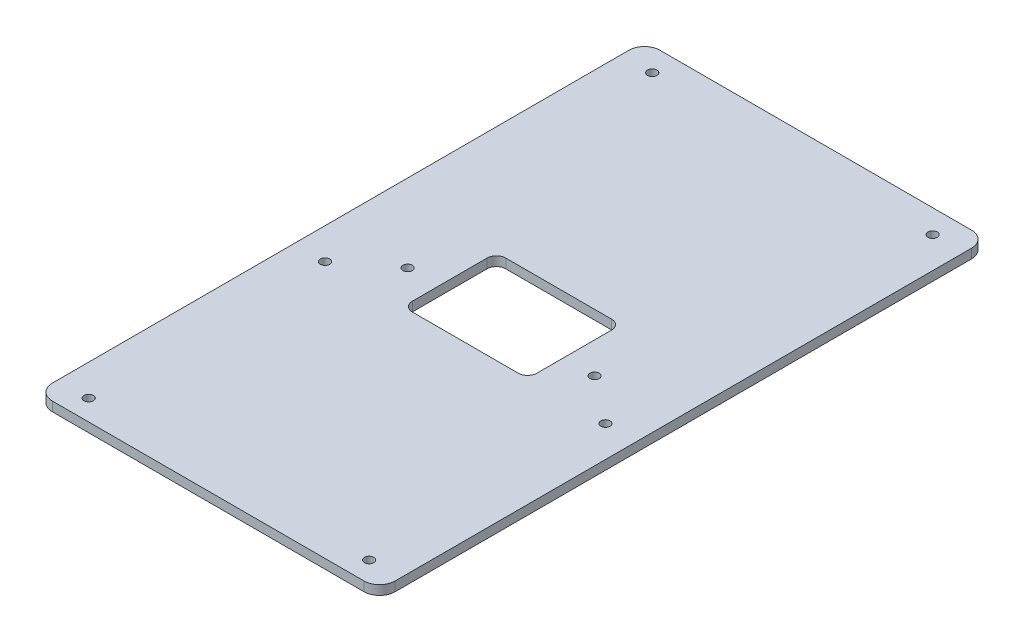
ISO-10303-21;
HEADER;
FILE_DESCRIPTION(('STEP AP214'),'2;1');
FILE_NAME('part.step','',(''),(''),'','','');
FILE_SCHEMA(('AUTOMOTIVE_DESIGN { 1 0 10303 214 1 1 1 1 }'));
ENDSEC;
DATA;
#1=APPLICATION_CONTEXT('core data for automotive mechanical design processes');
#2=APPLICATION_PROTOCOL_DEFINITION('international standard','automotive_design',2000,#1);
#3=PRODUCT_CONTEXT('',#1,'mechanical');
#4=PRODUCT('Part','Part','',(#3));
#5=PRODUCT_RELATED_PRODUCT_CATEGORY('part','',(#4));
#6=PRODUCT_DEFINITION_FORMATION('','',#4);
#7=PRODUCT_DEFINITION_CONTEXT('part definition',#1,'design');
#8=PRODUCT_DEFINITION('design','',#6,#7);
#9=PRODUCT_DEFINITION_SHAPE('','',#8);
#10=(LENGTH_UNIT() NAMED_UNIT(*) SI_UNIT(.MILLI.,.METRE.));
#11=(NAMED_UNIT(*) PLANE_ANGLE_UNIT() SI_UNIT($,.RADIAN.));
#12=(NAMED_UNIT(*) SI_UNIT($,.STERADIAN.) SOLID_ANGLE_UNIT());
#13=UNCERTAINTY_MEASURE_WITH_UNIT(LENGTH_MEASURE(1.E-05),#10,'distance_accuracy_value','');
#14=(GEOMETRIC_REPRESENTATION_CONTEXT(3) GLOBAL_UNCERTAINTY_ASSIGNED_CONTEXT((#13)) GLOBAL_UNIT_ASSIGNED_CONTEXT((#10,
#11,#12)) REPRESENTATION_CONTEXT('',''));
#15=CARTESIAN_POINT('',(0.,0.,0.));
#16=DIRECTION('',(0.,0.,1.));
#17=DIRECTION('',(1.,0.,0.));
#18=AXIS2_PLACEMENT_3D('',#15,#16,#17);
#19=CARTESIAN_POINT('',(55.,3.,97.5));
#20=DIRECTION('',(-1.,0.,0.));
#21=DIRECTION('',(0.,0.,1.));
#22=AXIS2_PLACEMENT_3D('',#19,#20,#21);
#23=PLANE('',#22);
#24=DIRECTION('',(0.,0.,-1.));
#25=VECTOR('',#24,1.);
#26=CARTESIAN_POINT('',(55.,0.,97.5));
#27=LINE('',#26,#25);
#28=CARTESIAN_POINT('',(55.,0.,92.5));
#29=VERTEX_POINT('',#28);
#30=CARTESIAN_POINT('',(55.,0.,-92.5));
#31=VERTEX_POINT('',#30);
#32=EDGE_CURVE('E184',#29,#31,#27,.T.);
#33=ORIENTED_EDGE('',*,*,#32,.T.);
#34=DIRECTION('',(0.,-1.,0.));
#35=VECTOR('',#34,1.);
#36=CARTESIAN_POINT('',(55.,3.,-92.5));
#37=LINE('',#36,#35);
#38=CARTESIAN_POINT('',(55.,3.,-92.5));
#39=VERTEX_POINT('',#38);
#40=EDGE_CURVE('E213',#31,#39,#37,.F.);
#41=ORIENTED_EDGE('',*,*,#40,.T.);
#42=DIRECTION('',(0.,0.,-1.));
#43=VECTOR('',#42,1.);
#44=CARTESIAN_POINT('',(55.,3.,97.5));
#45=LINE('',#44,#43);
#46=CARTESIAN_POINT('',(55.,3.,92.5));
#47=VERTEX_POINT('',#46);
#48=EDGE_CURVE('E182',#47,#39,#45,.T.);
#49=ORIENTED_EDGE('',*,*,#48,.F.);
#50=DIRECTION('',(0.,-1.,0.));
#51=VECTOR('',#50,1.);
#52=CARTESIAN_POINT('',(55.,3.,92.5));
#53=LINE('',#52,#51);
#54=EDGE_CURVE('E210',#47,#29,#53,.T.);
#55=ORIENTED_EDGE('',*,*,#54,.T.);
#56=EDGE_LOOP('',(#33,#41,#49,#55));
#57=FACE_BOUND('',#56,.T.);
#58=ADVANCED_FACE('F38',(#57),#23,.F.);
#59=CARTESIAN_POINT('',(-55.,3.,-97.5));
#60=DIRECTION('',(0.,0.,1.));
#61=DIRECTION('',(1.,0.,0.));
#62=AXIS2_PLACEMENT_3D('',#59,#60,#61);
#63=PLANE('',#62);
#64=DIRECTION('',(-1.,0.,0.));
#65=VECTOR('',#64,1.);
#66=CARTESIAN_POINT('',(-55.,0.,-97.5));
#67=LINE('',#66,#65);
#68=CARTESIAN_POINT('',(50.,0.,-97.5));
#69=VERTEX_POINT('',#68);
#70=CARTESIAN_POINT('',(-50.,0.,-97.5));
#71=VERTEX_POINT('',#70);
#72=EDGE_CURVE('E179',#69,#71,#67,.T.);
#73=ORIENTED_EDGE('',*,*,#72,.T.);
#74=DIRECTION('',(0.,-1.,0.));
#75=VECTOR('',#74,1.);
#76=CARTESIAN_POINT('',(-50.,3.,-97.5));
#77=LINE('',#76,#75);
#78=CARTESIAN_POINT('',(-50.,3.,-97.5));
#79=VERTEX_POINT('',#78);
#80=EDGE_CURVE('E157',#71,#79,#77,.F.);
#81=ORIENTED_EDGE('',*,*,#80,.T.);
#82=DIRECTION('',(-1.,0.,0.));
#83=VECTOR('',#82,1.);
#84=CARTESIAN_POINT('',(-55.,3.,-97.5));
#85=LINE('',#84,#83);
#86=CARTESIAN_POINT('',(50.,3.,-97.5));
#87=VERTEX_POINT('',#86);
#88=EDGE_CURVE('E332',#87,#79,#85,.T.);
#89=ORIENTED_EDGE('',*,*,#88,.F.);
#90=DIRECTION('',(0.,-1.,0.));
#91=VECTOR('',#90,1.);
#92=CARTESIAN_POINT('',(50.,3.,-97.5));
#93=LINE('',#92,#91);
#94=EDGE_CURVE('E162',#87,#69,#93,.T.);
#95=ORIENTED_EDGE('',*,*,#94,.T.);
#96=EDGE_LOOP('',(#73,#81,#89,#95));
#97=FACE_BOUND('',#96,.T.);
#98=ADVANCED_FACE('F350',(#97),#63,.F.);
#99=CARTESIAN_POINT('',(-55.,3.,97.5));
#100=DIRECTION('',(1.,0.,0.));
#101=DIRECTION('',(0.,0.,-1.));
#102=AXIS2_PLACEMENT_3D('',#99,#100,#101);
#103=PLANE('',#102);
#104=DIRECTION('',(0.,0.,1.));
#105=VECTOR('',#104,1.);
#106=CARTESIAN_POINT('',(-55.,3.,97.5));
#107=LINE('',#106,#105);
#108=CARTESIAN_POINT('',(-55.,3.,-92.5));
#109=VERTEX_POINT('',#108);
#110=CARTESIAN_POINT('',(-55.,3.,92.5));
#111=VERTEX_POINT('',#110);
#112=EDGE_CURVE('E172',#109,#111,#107,.T.);
#113=ORIENTED_EDGE('',*,*,#112,.F.);
#114=DIRECTION('',(0.,-1.,0.));
#115=VECTOR('',#114,1.);
#116=CARTESIAN_POINT('',(-55.,3.,-92.5));
#117=LINE('',#116,#115);
#118=CARTESIAN_POINT('',(-55.,0.,-92.5));
#119=VERTEX_POINT('',#118);
#120=EDGE_CURVE('E156',#109,#119,#117,.T.);
#121=ORIENTED_EDGE('',*,*,#120,.T.);
#122=DIRECTION('',(0.,0.,1.));
#123=VECTOR('',#122,1.);
#124=CARTESIAN_POINT('',(-55.,0.,97.5));
#125=LINE('',#124,#123);
#126=CARTESIAN_POINT('',(-55.,0.,92.5));
#127=VERTEX_POINT('',#126);
#128=EDGE_CURVE('E169',#119,#127,#125,.T.);
#129=ORIENTED_EDGE('',*,*,#128,.T.);
#130=DIRECTION('',(0.,-1.,0.));
#131=VECTOR('',#130,1.);
#132=CARTESIAN_POINT('',(-55.,3.,92.5));
#133=LINE('',#132,#131);
#134=EDGE_CURVE('E174',#127,#111,#133,.F.);
#135=ORIENTED_EDGE('',*,*,#134,.T.);
#136=EDGE_LOOP('',(#113,#121,#129,#135));
#137=FACE_BOUND('',#136,.T.);
#138=ADVANCED_FACE('F168',(#137),#103,.F.);
#139=CARTESIAN_POINT('',(-55.,3.,97.5));
#140=DIRECTION('',(0.,0.,-1.));
#141=DIRECTION('',(-1.,0.,0.));
#142=AXIS2_PLACEMENT_3D('',#139,#140,#141);
#143=PLANE('',#142);
#144=DIRECTION('',(1.,0.,0.));
#145=VECTOR('',#144,1.);
#146=CARTESIAN_POINT('',(-55.,3.,97.5));
#147=LINE('',#146,#145);
#148=CARTESIAN_POINT('',(-50.,3.,97.5));
#149=VERTEX_POINT('',#148);
#150=CARTESIAN_POINT('',(50.,3.,97.5));
#151=VERTEX_POINT('',#150);
#152=EDGE_CURVE('E188',#149,#151,#147,.T.);
#153=ORIENTED_EDGE('',*,*,#152,.F.);
#154=DIRECTION('',(0.,-1.,0.));
#155=VECTOR('',#154,1.);
#156=CARTESIAN_POINT('',(-50.,3.,97.5));
#157=LINE('',#156,#155);
#158=CARTESIAN_POINT('',(-50.,0.,97.5));
#159=VERTEX_POINT('',#158);
#160=EDGE_CURVE('E207',#149,#159,#157,.T.);
#161=ORIENTED_EDGE('',*,*,#160,.T.);
#162=DIRECTION('',(1.,0.,0.));
#163=VECTOR('',#162,1.);
#164=CARTESIAN_POINT('',(-55.,0.,97.5));
#165=LINE('',#164,#163);
#166=CARTESIAN_POINT('',(50.,0.,97.5));
#167=VERTEX_POINT('',#166);
#168=EDGE_CURVE('E178',#159,#167,#165,.T.);
#169=ORIENTED_EDGE('',*,*,#168,.T.);
#170=DIRECTION('',(0.,-1.,0.));
#171=VECTOR('',#170,1.);
#172=CARTESIAN_POINT('',(50.,3.,97.5));
#173=LINE('',#172,#171);
#174=EDGE_CURVE('E205',#167,#151,#173,.F.);
#175=ORIENTED_EDGE('',*,*,#174,.T.);
#176=EDGE_LOOP('',(#153,#161,#169,#175));
#177=FACE_BOUND('',#176,.T.);
#178=ADVANCED_FACE('F357',(#177),#143,.F.);
#179=CARTESIAN_POINT('',(0.,3.,0.));
#180=DIRECTION('',(0.,-1.,0.));
#181=DIRECTION('',(0.,0.,-1.));
#182=AXIS2_PLACEMENT_3D('',#179,#180,#181);
#183=PLANE('',#182);
#184=DIRECTION('',(-1.,0.,0.));
#185=VECTOR('',#184,1.);
#186=CARTESIAN_POINT('',(-20.,3.,-15.));
#187=LINE('',#186,#185);
#188=CARTESIAN_POINT('',(17.,3.,-15.));
#189=VERTEX_POINT('',#188);
#190=CARTESIAN_POINT('',(-17.,3.,-15.));
#191=VERTEX_POINT('',#190);
#192=EDGE_CURVE('E249',#189,#191,#187,.T.);
#193=ORIENTED_EDGE('',*,*,#192,.F.);
#194=CARTESIAN_POINT('',(17.,3.,-12.));
#195=DIRECTION('',(0.,-1.,0.));
#196=DIRECTION('',(0.,0.,-1.));
#197=AXIS2_PLACEMENT_3D('',#194,#195,#196);
#198=CIRCLE('',#197,3.);
#199=CARTESIAN_POINT('',(20.,3.,-12.));
#200=VERTEX_POINT('',#199);
#201=EDGE_CURVE('E242',#189,#200,#198,.T.);
#202=ORIENTED_EDGE('',*,*,#201,.T.);
#203=DIRECTION('',(0.,0.,-1.));
#204=VECTOR('',#203,1.);
#205=CARTESIAN_POINT('',(20.,3.,-15.));
#206=LINE('',#205,#204);
#207=CARTESIAN_POINT('',(20.,3.,12.));
#208=VERTEX_POINT('',#207);
#209=EDGE_CURVE('E256',#208,#200,#206,.T.);
#210=ORIENTED_EDGE('',*,*,#209,.F.);
#211=CARTESIAN_POINT('',(17.,3.,12.));
#212=DIRECTION('',(0.,-1.,0.));
#213=DIRECTION('',(0.,0.,-1.));
#214=AXIS2_PLACEMENT_3D('',#211,#212,#213);
#215=CIRCLE('',#214,3.);
#216=CARTESIAN_POINT('',(17.,3.,15.));
#217=VERTEX_POINT('',#216);
#218=EDGE_CURVE('E234',#208,#217,#215,.T.);
#219=ORIENTED_EDGE('',*,*,#218,.T.);
#220=DIRECTION('',(1.,0.,0.));
#221=VECTOR('',#220,1.);
#222=CARTESIAN_POINT('',(-20.,3.,15.));
#223=LINE('',#222,#221);
#224=CARTESIAN_POINT('',(-17.,3.,15.));
#225=VERTEX_POINT('',#224);
#226=EDGE_CURVE('E280',#225,#217,#223,.T.);
#227=ORIENTED_EDGE('',*,*,#226,.F.);
#228=CARTESIAN_POINT('',(-17.,3.,12.));
#229=DIRECTION('',(0.,-1.,0.));
#230=DIRECTION('',(0.,0.,-1.));
#231=AXIS2_PLACEMENT_3D('',#228,#229,#230);
#232=CIRCLE('',#231,3.);
#233=CARTESIAN_POINT('',(-20.,3.,12.));
#234=VERTEX_POINT('',#233);
#235=EDGE_CURVE('E238',#225,#234,#232,.T.);
#236=ORIENTED_EDGE('',*,*,#235,.T.);
#237=DIRECTION('',(0.,0.,1.));
#238=VECTOR('',#237,1.);
#239=CARTESIAN_POINT('',(-20.,3.,-15.));
#240=LINE('',#239,#238);
#241=CARTESIAN_POINT('',(-20.,3.,-12.));
#242=VERTEX_POINT('',#241);
#243=EDGE_CURVE('E251',#242,#234,#240,.T.);
#244=ORIENTED_EDGE('',*,*,#243,.F.);
#245=CARTESIAN_POINT('',(-17.,3.,-12.));
#246=DIRECTION('',(0.,-1.,0.));
#247=DIRECTION('',(0.,0.,-1.));
#248=AXIS2_PLACEMENT_3D('',#245,#246,#247);
#249=CIRCLE('',#248,3.);
#250=EDGE_CURVE('E46',#242,#191,#249,.T.);
#251=ORIENTED_EDGE('',*,*,#250,.T.);
#252=EDGE_LOOP('',(#193,#202,#210,#219,#227,#236,#244,#251));
#253=FACE_BOUND('',#252,.T.);
#254=CARTESIAN_POINT('',(-45.0000000000004,3.,15.0000000000002));
#255=DIRECTION('',(0.,1.,0.));
#256=DIRECTION('',(0.,0.,1.));
#257=AXIS2_PLACEMENT_3D('',#254,#255,#256);
#258=CIRCLE('',#257,1.49999999999999);
#259=CARTESIAN_POINT('',(-45.0000000000004,3.,16.5000000000001));
#260=VERTEX_POINT('',#259);
#261=EDGE_CURVE('E301',#260,#260,#258,.T.);
#262=ORIENTED_EDGE('',*,*,#261,.F.);
#263=EDGE_LOOP('',(#262));
#264=FACE_BOUND('',#263,.T.);
#265=CARTESIAN_POINT('',(-45.0000000000004,3.,-89.9999999999998));
#266=DIRECTION('',(0.,1.,0.));
#267=DIRECTION('',(0.,0.,1.));
#268=AXIS2_PLACEMENT_3D('',#265,#266,#267);
#269=CIRCLE('',#268,1.49999999999999);
#270=CARTESIAN_POINT('',(-45.0000000000004,3.,-88.4999999999998));
#271=VERTEX_POINT('',#270);
#272=EDGE_CURVE('E308',#271,#271,#269,.T.);
#273=ORIENTED_EDGE('',*,*,#272,.F.);
#274=EDGE_LOOP('',(#273));
#275=FACE_BOUND('',#274,.T.);
#276=CARTESIAN_POINT('',(-30.0000000000005,3.,3.50000000000018));
#277=DIRECTION('',(0.,1.,0.));
#278=DIRECTION('',(0.,0.,1.));
#279=AXIS2_PLACEMENT_3D('',#276,#277,#278);
#280=CIRCLE('',#279,1.5);
#281=CARTESIAN_POINT('',(-30.0000000000005,3.,5.00000000000019));
#282=VERTEX_POINT('',#281);
#283=EDGE_CURVE('E314',#282,#282,#280,.T.);
#284=ORIENTED_EDGE('',*,*,#283,.F.);
#285=EDGE_LOOP('',(#284));
#286=FACE_BOUND('',#285,.T.);
#287=CARTESIAN_POINT('',(44.9999999999995,3.,-89.9999999999998));
#288=DIRECTION('',(0.,1.,0.));
#289=DIRECTION('',(0.,0.,1.));
#290=AXIS2_PLACEMENT_3D('',#287,#288,#289);
#291=CIRCLE('',#290,1.49999999999999);
#292=CARTESIAN_POINT('',(44.9999999999995,3.,-88.4999999999998));
#293=VERTEX_POINT('',#292);
#294=EDGE_CURVE('E320',#293,#293,#291,.T.);
#295=ORIENTED_EDGE('',*,*,#294,.F.);
#296=EDGE_LOOP('',(#295));
#297=FACE_BOUND('',#296,.T.);
#298=CARTESIAN_POINT('',(44.9999999999995,3.,15.0000000000002));
#299=DIRECTION('',(0.,1.,0.));
#300=DIRECTION('',(0.,0.,1.));
#301=AXIS2_PLACEMENT_3D('',#298,#299,#300);
#302=CIRCLE('',#301,1.49999999999999);
#303=CARTESIAN_POINT('',(44.9999999999995,3.,16.5000000000001));
#304=VERTEX_POINT('',#303);
#305=EDGE_CURVE('E283',#304,#304,#302,.T.);
#306=ORIENTED_EDGE('',*,*,#305,.F.);
#307=EDGE_LOOP('',(#306));
#308=FACE_BOUND('',#307,.T.);
#309=CARTESIAN_POINT('',(44.9999999999995,3.,90.8578643762692));
#310=DIRECTION('',(0.,1.,0.));
#311=DIRECTION('',(0.,0.,1.));
#312=AXIS2_PLACEMENT_3D('',#309,#310,#311);
#313=CIRCLE('',#312,1.49999999999999);
#314=CARTESIAN_POINT('',(44.9999999999995,3.,92.3578643762692));
#315=VERTEX_POINT('',#314);
#316=EDGE_CURVE('E290',#315,#315,#313,.T.);
#317=ORIENTED_EDGE('',*,*,#316,.F.);
#318=EDGE_LOOP('',(#317));
#319=FACE_BOUND('',#318,.T.);
#320=CARTESIAN_POINT('',(29.9999999999995,3.,3.50000000000018));
#321=DIRECTION('',(0.,1.,0.));
#322=DIRECTION('',(0.,0.,1.));
#323=AXIS2_PLACEMENT_3D('',#320,#321,#322);
#324=CIRCLE('',#323,1.50000000000001);
#325=CARTESIAN_POINT('',(29.9999999999995,3.,5.00000000000019));
#326=VERTEX_POINT('',#325);
#327=EDGE_CURVE('E296',#326,#326,#324,.T.);
#328=ORIENTED_EDGE('',*,*,#327,.F.);
#329=EDGE_LOOP('',(#328));
#330=FACE_BOUND('',#329,.T.);
#331=CARTESIAN_POINT('',(-45.0000000000004,3.,90.8578643762692));
#332=DIRECTION('',(0.,1.,0.));
#333=DIRECTION('',(0.,0.,1.));
#334=AXIS2_PLACEMENT_3D('',#331,#332,#333);
#335=CIRCLE('',#334,1.49999999999999);
#336=CARTESIAN_POINT('',(-45.0000000000004,3.,92.3578643762692));
#337=VERTEX_POINT('',#336);
#338=EDGE_CURVE('E304',#337,#337,#335,.T.);
#339=ORIENTED_EDGE('',*,*,#338,.F.);
#340=EDGE_LOOP('',(#339));
#341=FACE_BOUND('',#340,.T.);
#342=ORIENTED_EDGE('',*,*,#88,.T.);
#343=CARTESIAN_POINT('',(-50.,3.,-92.5));
#344=DIRECTION('',(0.,-1.,0.));
#345=DIRECTION('',(0.,0.,-1.));
#346=AXIS2_PLACEMENT_3D('',#343,#344,#345);
#347=CIRCLE('',#346,5.);
#348=EDGE_CURVE('E203',#79,#109,#347,.F.);
#349=ORIENTED_EDGE('',*,*,#348,.T.);
#350=ORIENTED_EDGE('',*,*,#112,.T.);
#351=CARTESIAN_POINT('',(-50.,3.,92.5));
#352=DIRECTION('',(0.,-1.,0.));
#353=DIRECTION('',(0.,0.,-1.));
#354=AXIS2_PLACEMENT_3D('',#351,#352,#353);
#355=CIRCLE('',#354,5.);
#356=EDGE_CURVE('E201',#111,#149,#355,.F.);
#357=ORIENTED_EDGE('',*,*,#356,.T.);
#358=ORIENTED_EDGE('',*,*,#152,.T.);
#359=CARTESIAN_POINT('',(50.,3.,92.5));
#360=DIRECTION('',(0.,-1.,0.));
#361=DIRECTION('',(0.,0.,-1.));
#362=AXIS2_PLACEMENT_3D('',#359,#360,#361);
#363=CIRCLE('',#362,5.);
#364=EDGE_CURVE('E197',#151,#47,#363,.F.);
#365=ORIENTED_EDGE('',*,*,#364,.T.);
#366=ORIENTED_EDGE('',*,*,#48,.T.);
#367=CARTESIAN_POINT('',(50.,3.,-92.5));
#368=DIRECTION('',(0.,-1.,0.));
#369=DIRECTION('',(0.,0.,-1.));
#370=AXIS2_PLACEMENT_3D('',#367,#368,#369);
#371=CIRCLE('',#370,5.);
#372=EDGE_CURVE('E199',#39,#87,#371,.F.);
#373=ORIENTED_EDGE('',*,*,#372,.T.);
#374=EDGE_LOOP('',(#342,#349,#350,#357,#358,#365,#366,#373));
#375=FACE_BOUND('',#374,.T.);
#376=ADVANCED_FACE('F247',(#253,#264,#275,#286,#297,#308,#319,#330,#341,#375),#183,.F.);
#377=CARTESIAN_POINT('',(0.,0.,0.));
#378=DIRECTION('',(0.,-1.,0.));
#379=DIRECTION('',(0.,0.,-1.));
#380=AXIS2_PLACEMENT_3D('',#377,#378,#379);
#381=PLANE('',#380);
#382=DIRECTION('',(1.,0.,0.));
#383=VECTOR('',#382,1.);
#384=CARTESIAN_POINT('',(-20.,0.,15.));
#385=LINE('',#384,#383);
#386=CARTESIAN_POINT('',(-17.,0.,15.));
#387=VERTEX_POINT('',#386);
#388=CARTESIAN_POINT('',(17.,0.,15.));
#389=VERTEX_POINT('',#388);
#390=EDGE_CURVE('E269',#387,#389,#385,.T.);
#391=ORIENTED_EDGE('',*,*,#390,.T.);
#392=CARTESIAN_POINT('',(17.,0.,12.));
#393=DIRECTION('',(0.,-1.,0.));
#394=DIRECTION('',(0.,0.,-1.));
#395=AXIS2_PLACEMENT_3D('',#392,#393,#394);
#396=CIRCLE('',#395,3.);
#397=CARTESIAN_POINT('',(20.,0.,12.));
#398=VERTEX_POINT('',#397);
#399=EDGE_CURVE('E236',#389,#398,#396,.F.);
#400=ORIENTED_EDGE('',*,*,#399,.T.);
#401=DIRECTION('',(0.,0.,-1.));
#402=VECTOR('',#401,1.);
#403=CARTESIAN_POINT('',(20.,0.,-15.));
#404=LINE('',#403,#402);
#405=CARTESIAN_POINT('',(20.,0.,-12.));
#406=VERTEX_POINT('',#405);
#407=EDGE_CURVE('E273',#398,#406,#404,.T.);
#408=ORIENTED_EDGE('',*,*,#407,.T.);
#409=CARTESIAN_POINT('',(17.,0.,-12.));
#410=DIRECTION('',(0.,-1.,0.));
#411=DIRECTION('',(0.,0.,-1.));
#412=AXIS2_PLACEMENT_3D('',#409,#410,#411);
#413=CIRCLE('',#412,3.);
#414=CARTESIAN_POINT('',(17.,0.,-15.));
#415=VERTEX_POINT('',#414);
#416=EDGE_CURVE('E60',#406,#415,#413,.F.);
#417=ORIENTED_EDGE('',*,*,#416,.T.);
#418=DIRECTION('',(-1.,0.,0.));
#419=VECTOR('',#418,1.);
#420=CARTESIAN_POINT('',(-20.,0.,-15.));
#421=LINE('',#420,#419);
#422=CARTESIAN_POINT('',(-17.,0.,-15.));
#423=VERTEX_POINT('',#422);
#424=EDGE_CURVE('E265',#415,#423,#421,.T.);
#425=ORIENTED_EDGE('',*,*,#424,.T.);
#426=CARTESIAN_POINT('',(-17.,0.,-12.));
#427=DIRECTION('',(0.,-1.,0.));
#428=DIRECTION('',(0.,0.,-1.));
#429=AXIS2_PLACEMENT_3D('',#426,#427,#428);
#430=CIRCLE('',#429,3.);
#431=CARTESIAN_POINT('',(-20.,0.,-12.));
#432=VERTEX_POINT('',#431);
#433=EDGE_CURVE('E11',#423,#432,#430,.F.);
#434=ORIENTED_EDGE('',*,*,#433,.T.);
#435=DIRECTION('',(0.,0.,1.));
#436=VECTOR('',#435,1.);
#437=CARTESIAN_POINT('',(-20.,0.,-15.));
#438=LINE('',#437,#436);
#439=CARTESIAN_POINT('',(-20.,0.,12.));
#440=VERTEX_POINT('',#439);
#441=EDGE_CURVE('E263',#432,#440,#438,.T.);
#442=ORIENTED_EDGE('',*,*,#441,.T.);
#443=CARTESIAN_POINT('',(-17.,0.,12.));
#444=DIRECTION('',(0.,-1.,0.));
#445=DIRECTION('',(0.,0.,-1.));
#446=AXIS2_PLACEMENT_3D('',#443,#444,#445);
#447=CIRCLE('',#446,3.);
#448=EDGE_CURVE('E240',#440,#387,#447,.F.);
#449=ORIENTED_EDGE('',*,*,#448,.T.);
#450=EDGE_LOOP('',(#391,#400,#408,#417,#425,#434,#442,#449));
#451=FACE_BOUND('',#450,.T.);
#452=CARTESIAN_POINT('',(-45.0000000000004,0.,15.0000000000002));
#453=DIRECTION('',(0.,1.,0.));
#454=DIRECTION('',(0.,0.,1.));
#455=AXIS2_PLACEMENT_3D('',#452,#453,#454);
#456=CIRCLE('',#455,1.49999999999999);
#457=CARTESIAN_POINT('',(-45.0000000000004,0.,16.5000000000001));
#458=VERTEX_POINT('',#457);
#459=EDGE_CURVE('E305',#458,#458,#456,.T.);
#460=ORIENTED_EDGE('',*,*,#459,.T.);
#461=EDGE_LOOP('',(#460));
#462=FACE_BOUND('',#461,.T.);
#463=CARTESIAN_POINT('',(-45.0000000000004,0.,-89.9999999999998));
#464=DIRECTION('',(0.,1.,0.));
#465=DIRECTION('',(0.,0.,1.));
#466=AXIS2_PLACEMENT_3D('',#463,#464,#465);
#467=CIRCLE('',#466,1.49999999999999);
#468=CARTESIAN_POINT('',(-45.0000000000004,0.,-88.4999999999998));
#469=VERTEX_POINT('',#468);
#470=EDGE_CURVE('E311',#469,#469,#467,.T.);
#471=ORIENTED_EDGE('',*,*,#470,.T.);
#472=EDGE_LOOP('',(#471));
#473=FACE_BOUND('',#472,.T.);
#474=CARTESIAN_POINT('',(-30.0000000000005,0.,3.50000000000018));
#475=DIRECTION('',(0.,1.,0.));
#476=DIRECTION('',(0.,0.,1.));
#477=AXIS2_PLACEMENT_3D('',#474,#475,#476);
#478=CIRCLE('',#477,1.5);
#479=CARTESIAN_POINT('',(-30.0000000000005,0.,5.00000000000019));
#480=VERTEX_POINT('',#479);
#481=EDGE_CURVE('E317',#480,#480,#478,.T.);
#482=ORIENTED_EDGE('',*,*,#481,.T.);
#483=EDGE_LOOP('',(#482));
#484=FACE_BOUND('',#483,.T.);
#485=CARTESIAN_POINT('',(44.9999999999995,0.,-89.9999999999998));
#486=DIRECTION('',(0.,1.,0.));
#487=DIRECTION('',(0.,0.,1.));
#488=AXIS2_PLACEMENT_3D('',#485,#486,#487);
#489=CIRCLE('',#488,1.49999999999999);
#490=CARTESIAN_POINT('',(44.9999999999995,0.,-88.4999999999998));
#491=VERTEX_POINT('',#490);
#492=EDGE_CURVE('E286',#491,#491,#489,.T.);
#493=ORIENTED_EDGE('',*,*,#492,.T.);
#494=EDGE_LOOP('',(#493));
#495=FACE_BOUND('',#494,.T.);
#496=CARTESIAN_POINT('',(44.9999999999995,0.,15.0000000000002));
#497=DIRECTION('',(0.,1.,0.));
#498=DIRECTION('',(0.,0.,1.));
#499=AXIS2_PLACEMENT_3D('',#496,#497,#498);
#500=CIRCLE('',#499,1.49999999999999);
#501=CARTESIAN_POINT('',(44.9999999999995,0.,16.5000000000001));
#502=VERTEX_POINT('',#501);
#503=EDGE_CURVE('E287',#502,#502,#500,.T.);
#504=ORIENTED_EDGE('',*,*,#503,.T.);
#505=EDGE_LOOP('',(#504));
#506=FACE_BOUND('',#505,.T.);
#507=CARTESIAN_POINT('',(44.9999999999995,0.,90.8578643762692));
#508=DIRECTION('',(0.,1.,0.));
#509=DIRECTION('',(0.,0.,1.));
#510=AXIS2_PLACEMENT_3D('',#507,#508,#509);
#511=CIRCLE('',#510,1.49999999999999);
#512=CARTESIAN_POINT('',(44.9999999999995,0.,92.3578643762692));
#513=VERTEX_POINT('',#512);
#514=EDGE_CURVE('E293',#513,#513,#511,.T.);
#515=ORIENTED_EDGE('',*,*,#514,.T.);
#516=EDGE_LOOP('',(#515));
#517=FACE_BOUND('',#516,.T.);
#518=CARTESIAN_POINT('',(29.9999999999995,0.,3.50000000000018));
#519=DIRECTION('',(0.,1.,0.));
#520=DIRECTION('',(0.,0.,1.));
#521=AXIS2_PLACEMENT_3D('',#518,#519,#520);
#522=CIRCLE('',#521,1.50000000000001);
#523=CARTESIAN_POINT('',(29.9999999999995,0.,5.00000000000019));
#524=VERTEX_POINT('',#523);
#525=EDGE_CURVE('E271',#524,#524,#522,.T.);
#526=ORIENTED_EDGE('',*,*,#525,.T.);
#527=EDGE_LOOP('',(#526));
#528=FACE_BOUND('',#527,.T.);
#529=CARTESIAN_POINT('',(-45.0000000000004,0.,90.8578643762692));
#530=DIRECTION('',(0.,1.,0.));
#531=DIRECTION('',(0.,0.,1.));
#532=AXIS2_PLACEMENT_3D('',#529,#530,#531);
#533=CIRCLE('',#532,1.49999999999999);
#534=CARTESIAN_POINT('',(-45.0000000000004,0.,92.3578643762692));
#535=VERTEX_POINT('',#534);
#536=EDGE_CURVE('E325',#535,#535,#533,.T.);
#537=ORIENTED_EDGE('',*,*,#536,.T.);
#538=EDGE_LOOP('',(#537));
#539=FACE_BOUND('',#538,.T.);
#540=ORIENTED_EDGE('',*,*,#128,.F.);
#541=CARTESIAN_POINT('',(-50.,0.,-92.5));
#542=DIRECTION('',(0.,-1.,0.));
#543=DIRECTION('',(0.,0.,-1.));
#544=AXIS2_PLACEMENT_3D('',#541,#542,#543);
#545=CIRCLE('',#544,5.);
#546=EDGE_CURVE('E152',#119,#71,#545,.T.);
#547=ORIENTED_EDGE('',*,*,#546,.T.);
#548=ORIENTED_EDGE('',*,*,#72,.F.);
#549=CARTESIAN_POINT('',(50.,0.,-92.5));
#550=DIRECTION('',(0.,-1.,0.));
#551=DIRECTION('',(0.,0.,-1.));
#552=AXIS2_PLACEMENT_3D('',#549,#550,#551);
#553=CIRCLE('',#552,5.);
#554=EDGE_CURVE('E191',#69,#31,#553,.T.);
#555=ORIENTED_EDGE('',*,*,#554,.T.);
#556=ORIENTED_EDGE('',*,*,#32,.F.);
#557=CARTESIAN_POINT('',(50.,0.,92.5));
#558=DIRECTION('',(0.,-1.,0.));
#559=DIRECTION('',(0.,0.,-1.));
#560=AXIS2_PLACEMENT_3D('',#557,#558,#559);
#561=CIRCLE('',#560,5.);
#562=EDGE_CURVE('E173',#29,#167,#561,.T.);
#563=ORIENTED_EDGE('',*,*,#562,.T.);
#564=ORIENTED_EDGE('',*,*,#168,.F.);
#565=CARTESIAN_POINT('',(-50.,0.,92.5));
#566=DIRECTION('',(0.,-1.,0.));
#567=DIRECTION('',(0.,0.,-1.));
#568=AXIS2_PLACEMENT_3D('',#565,#566,#567);
#569=CIRCLE('',#568,5.);
#570=EDGE_CURVE('E163',#159,#127,#569,.T.);
#571=ORIENTED_EDGE('',*,*,#570,.T.);
#572=EDGE_LOOP('',(#540,#547,#548,#555,#556,#563,#564,#571));
#573=FACE_BOUND('',#572,.T.);
#574=ADVANCED_FACE('F176',(#451,#462,#473,#484,#495,#506,#517,#528,#539,#573),#381,.T.);
#575=CARTESIAN_POINT('',(-50.,3.,-92.5));
#576=DIRECTION('',(0.,-1.,0.));
#577=DIRECTION('',(0.,0.,-1.));
#578=AXIS2_PLACEMENT_3D('',#575,#576,#577);
#579=CYLINDRICAL_SURFACE('',#578,5.);
#580=ORIENTED_EDGE('',*,*,#348,.F.);
#581=ORIENTED_EDGE('',*,*,#80,.F.);
#582=ORIENTED_EDGE('',*,*,#546,.F.);
#583=ORIENTED_EDGE('',*,*,#120,.F.);
#584=EDGE_LOOP('',(#580,#581,#582,#583));
#585=FACE_BOUND('',#584,.T.);
#586=ADVANCED_FACE('F155',(#585),#579,.T.);
#587=CARTESIAN_POINT('',(-50.,3.,92.5));
#588=DIRECTION('',(0.,-1.,0.));
#589=DIRECTION('',(0.,0.,-1.));
#590=AXIS2_PLACEMENT_3D('',#587,#588,#589);
#591=CYLINDRICAL_SURFACE('',#590,5.);
#592=ORIENTED_EDGE('',*,*,#356,.F.);
#593=ORIENTED_EDGE('',*,*,#134,.F.);
#594=ORIENTED_EDGE('',*,*,#570,.F.);
#595=ORIENTED_EDGE('',*,*,#160,.F.);
#596=EDGE_LOOP('',(#592,#593,#594,#595));
#597=FACE_BOUND('',#596,.T.);
#598=ADVANCED_FACE('F364',(#597),#591,.T.);
#599=CARTESIAN_POINT('',(50.,3.,-92.5));
#600=DIRECTION('',(0.,-1.,0.));
#601=DIRECTION('',(0.,0.,-1.));
#602=AXIS2_PLACEMENT_3D('',#599,#600,#601);
#603=CYLINDRICAL_SURFACE('',#602,5.);
#604=ORIENTED_EDGE('',*,*,#372,.F.);
#605=ORIENTED_EDGE('',*,*,#40,.F.);
#606=ORIENTED_EDGE('',*,*,#554,.F.);
#607=ORIENTED_EDGE('',*,*,#94,.F.);
#608=EDGE_LOOP('',(#604,#605,#606,#607));
#609=FACE_BOUND('',#608,.T.);
#610=ADVANCED_FACE('F345',(#609),#603,.T.);
#611=CARTESIAN_POINT('',(50.,3.,92.5));
#612=DIRECTION('',(0.,-1.,0.));
#613=DIRECTION('',(0.,0.,-1.));
#614=AXIS2_PLACEMENT_3D('',#611,#612,#613);
#615=CYLINDRICAL_SURFACE('',#614,5.);
#616=ORIENTED_EDGE('',*,*,#364,.F.);
#617=ORIENTED_EDGE('',*,*,#174,.F.);
#618=ORIENTED_EDGE('',*,*,#562,.F.);
#619=ORIENTED_EDGE('',*,*,#54,.F.);
#620=EDGE_LOOP('',(#616,#617,#618,#619));
#621=FACE_BOUND('',#620,.T.);
#622=ADVANCED_FACE('F370',(#621),#615,.T.);
#623=CARTESIAN_POINT('',(-45.0000000000004,0.,90.8578643762692));
#624=DIRECTION('',(0.,1.,0.));
#625=DIRECTION('',(0.,0.,1.));
#626=AXIS2_PLACEMENT_3D('',#623,#624,#625);
#627=CYLINDRICAL_SURFACE('',#626,1.49999999999999);
#628=ORIENTED_EDGE('',*,*,#536,.F.);
#629=EDGE_LOOP('',(#628));
#630=FACE_BOUND('',#629,.T.);
#631=ORIENTED_EDGE('',*,*,#338,.T.);
#632=EDGE_LOOP('',(#631));
#633=FACE_BOUND('',#632,.T.);
#634=ADVANCED_FACE('F373',(#630,#633),#627,.F.);
#635=CARTESIAN_POINT('',(29.9999999999995,0.,3.50000000000018));
#636=DIRECTION('',(0.,1.,0.));
#637=DIRECTION('',(0.,0.,1.));
#638=AXIS2_PLACEMENT_3D('',#635,#636,#637);
#639=CYLINDRICAL_SURFACE('',#638,1.50000000000001);
#640=ORIENTED_EDGE('',*,*,#525,.F.);
#641=EDGE_LOOP('',(#640));
#642=FACE_BOUND('',#641,.T.);
#643=ORIENTED_EDGE('',*,*,#327,.T.);
#644=EDGE_LOOP('',(#643));
#645=FACE_BOUND('',#644,.T.);
#646=ADVANCED_FACE('F421',(#642,#645),#639,.F.);
#647=CARTESIAN_POINT('',(44.9999999999995,0.,90.8578643762692));
#648=DIRECTION('',(0.,1.,0.));
#649=DIRECTION('',(0.,0.,1.));
#650=AXIS2_PLACEMENT_3D('',#647,#648,#649);
#651=CYLINDRICAL_SURFACE('',#650,1.49999999999999);
#652=ORIENTED_EDGE('',*,*,#514,.F.);
#653=EDGE_LOOP('',(#652));
#654=FACE_BOUND('',#653,.T.);
#655=ORIENTED_EDGE('',*,*,#316,.T.);
#656=EDGE_LOOP('',(#655));
#657=FACE_BOUND('',#656,.T.);
#658=ADVANCED_FACE('F417',(#654,#657),#651,.F.);
#659=CARTESIAN_POINT('',(44.9999999999995,0.,15.0000000000002));
#660=DIRECTION('',(0.,1.,0.));
#661=DIRECTION('',(0.,0.,1.));
#662=AXIS2_PLACEMENT_3D('',#659,#660,#661);
#663=CYLINDRICAL_SURFACE('',#662,1.49999999999999);
#664=ORIENTED_EDGE('',*,*,#503,.F.);
#665=EDGE_LOOP('',(#664));
#666=FACE_BOUND('',#665,.T.);
#667=ORIENTED_EDGE('',*,*,#305,.T.);
#668=EDGE_LOOP('',(#667));
#669=FACE_BOUND('',#668,.T.);
#670=ADVANCED_FACE('F413',(#666,#669),#663,.F.);
#671=CARTESIAN_POINT('',(44.9999999999995,0.,-89.9999999999998));
#672=DIRECTION('',(0.,1.,0.));
#673=DIRECTION('',(0.,0.,1.));
#674=AXIS2_PLACEMENT_3D('',#671,#672,#673);
#675=CYLINDRICAL_SURFACE('',#674,1.49999999999999);
#676=ORIENTED_EDGE('',*,*,#492,.F.);
#677=EDGE_LOOP('',(#676));
#678=FACE_BOUND('',#677,.T.);
#679=ORIENTED_EDGE('',*,*,#294,.T.);
#680=EDGE_LOOP('',(#679));
#681=FACE_BOUND('',#680,.T.);
#682=ADVANCED_FACE('F416',(#678,#681),#675,.F.);
#683=CARTESIAN_POINT('',(-30.0000000000005,0.,3.50000000000018));
#684=DIRECTION('',(0.,1.,0.));
#685=DIRECTION('',(0.,0.,1.));
#686=AXIS2_PLACEMENT_3D('',#683,#684,#685);
#687=CYLINDRICAL_SURFACE('',#686,1.5);
#688=ORIENTED_EDGE('',*,*,#481,.F.);
#689=EDGE_LOOP('',(#688));
#690=FACE_BOUND('',#689,.T.);
#691=ORIENTED_EDGE('',*,*,#283,.T.);
#692=EDGE_LOOP('',(#691));
#693=FACE_BOUND('',#692,.T.);
#694=ADVANCED_FACE('F432',(#690,#693),#687,.F.);
#695=CARTESIAN_POINT('',(-45.0000000000004,0.,-89.9999999999998));
#696=DIRECTION('',(0.,1.,0.));
#697=DIRECTION('',(0.,0.,1.));
#698=AXIS2_PLACEMENT_3D('',#695,#696,#697);
#699=CYLINDRICAL_SURFACE('',#698,1.49999999999999);
#700=ORIENTED_EDGE('',*,*,#470,.F.);
#701=EDGE_LOOP('',(#700));
#702=FACE_BOUND('',#701,.T.);
#703=ORIENTED_EDGE('',*,*,#272,.T.);
#704=EDGE_LOOP('',(#703));
#705=FACE_BOUND('',#704,.T.);
#706=ADVANCED_FACE('F428',(#702,#705),#699,.F.);
#707=CARTESIAN_POINT('',(-45.0000000000004,0.,15.0000000000002));
#708=DIRECTION('',(0.,1.,0.));
#709=DIRECTION('',(0.,0.,1.));
#710=AXIS2_PLACEMENT_3D('',#707,#708,#709);
#711=CYLINDRICAL_SURFACE('',#710,1.49999999999999);
#712=ORIENTED_EDGE('',*,*,#459,.F.);
#713=EDGE_LOOP('',(#712));
#714=FACE_BOUND('',#713,.T.);
#715=ORIENTED_EDGE('',*,*,#261,.T.);
#716=EDGE_LOOP('',(#715));
#717=FACE_BOUND('',#716,.T.);
#718=ADVANCED_FACE('F408',(#714,#717),#711,.F.);
#719=CARTESIAN_POINT('',(20.,0.,-15.));
#720=DIRECTION('',(1.,0.,0.));
#721=DIRECTION('',(0.,0.,-1.));
#722=AXIS2_PLACEMENT_3D('',#719,#720,#721);
#723=PLANE('',#722);
#724=ORIENTED_EDGE('',*,*,#407,.F.);
#725=DIRECTION('',(0.,1.,0.));
#726=VECTOR('',#725,1.);
#727=CARTESIAN_POINT('',(20.,3.,12.));
#728=LINE('',#727,#726);
#729=EDGE_CURVE('E217',#398,#208,#728,.T.);
#730=ORIENTED_EDGE('',*,*,#729,.T.);
#731=ORIENTED_EDGE('',*,*,#209,.T.);
#732=DIRECTION('',(0.,1.,0.));
#733=VECTOR('',#732,1.);
#734=CARTESIAN_POINT('',(20.,0.,-12.));
#735=LINE('',#734,#733);
#736=EDGE_CURVE('E215',#200,#406,#735,.F.);
#737=ORIENTED_EDGE('',*,*,#736,.T.);
#738=EDGE_LOOP('',(#724,#730,#731,#737));
#739=FACE_BOUND('',#738,.T.);
#740=ADVANCED_FACE('F392',(#739),#723,.F.);
#741=CARTESIAN_POINT('',(-20.,0.,15.));
#742=DIRECTION('',(0.,0.,1.));
#743=DIRECTION('',(1.,0.,0.));
#744=AXIS2_PLACEMENT_3D('',#741,#742,#743);
#745=PLANE('',#744);
#746=ORIENTED_EDGE('',*,*,#226,.T.);
#747=DIRECTION('',(0.,1.,0.));
#748=VECTOR('',#747,1.);
#749=CARTESIAN_POINT('',(17.,0.,15.));
#750=LINE('',#749,#748);
#751=EDGE_CURVE('E223',#217,#389,#750,.F.);
#752=ORIENTED_EDGE('',*,*,#751,.T.);
#753=ORIENTED_EDGE('',*,*,#390,.F.);
#754=DIRECTION('',(0.,1.,0.));
#755=VECTOR('',#754,1.);
#756=CARTESIAN_POINT('',(-17.,3.,15.));
#757=LINE('',#756,#755);
#758=EDGE_CURVE('E220',#387,#225,#757,.T.);
#759=ORIENTED_EDGE('',*,*,#758,.T.);
#760=EDGE_LOOP('',(#746,#752,#753,#759));
#761=FACE_BOUND('',#760,.T.);
#762=ADVANCED_FACE('F398',(#761),#745,.F.);
#763=CARTESIAN_POINT('',(-20.,0.,-15.));
#764=DIRECTION('',(-1.,0.,0.));
#765=DIRECTION('',(0.,0.,1.));
#766=AXIS2_PLACEMENT_3D('',#763,#764,#765);
#767=PLANE('',#766);
#768=ORIENTED_EDGE('',*,*,#243,.T.);
#769=DIRECTION('',(0.,1.,0.));
#770=VECTOR('',#769,1.);
#771=CARTESIAN_POINT('',(-20.,0.,12.));
#772=LINE('',#771,#770);
#773=EDGE_CURVE('E228',#234,#440,#772,.F.);
#774=ORIENTED_EDGE('',*,*,#773,.T.);
#775=ORIENTED_EDGE('',*,*,#441,.F.);
#776=DIRECTION('',(0.,1.,0.));
#777=VECTOR('',#776,1.);
#778=CARTESIAN_POINT('',(-20.,3.,-12.));
#779=LINE('',#778,#777);
#780=EDGE_CURVE('E225',#432,#242,#779,.T.);
#781=ORIENTED_EDGE('',*,*,#780,.T.);
#782=EDGE_LOOP('',(#768,#774,#775,#781));
#783=FACE_BOUND('',#782,.T.);
#784=ADVANCED_FACE('F267',(#783),#767,.F.);
#785=CARTESIAN_POINT('',(-20.,0.,-15.));
#786=DIRECTION('',(0.,0.,-1.));
#787=DIRECTION('',(-1.,0.,0.));
#788=AXIS2_PLACEMENT_3D('',#785,#786,#787);
#789=PLANE('',#788);
#790=ORIENTED_EDGE('',*,*,#424,.F.);
#791=DIRECTION('',(0.,1.,0.));
#792=VECTOR('',#791,1.);
#793=CARTESIAN_POINT('',(17.,3.,-15.));
#794=LINE('',#793,#792);
#795=EDGE_CURVE('E231',#415,#189,#794,.T.);
#796=ORIENTED_EDGE('',*,*,#795,.T.);
#797=ORIENTED_EDGE('',*,*,#192,.T.);
#798=DIRECTION('',(0.,1.,0.));
#799=VECTOR('',#798,1.);
#800=CARTESIAN_POINT('',(-17.,0.,-15.));
#801=LINE('',#800,#799);
#802=EDGE_CURVE('E53',#191,#423,#801,.F.);
#803=ORIENTED_EDGE('',*,*,#802,.T.);
#804=EDGE_LOOP('',(#790,#796,#797,#803));
#805=FACE_BOUND('',#804,.T.);
#806=ADVANCED_FACE('F254',(#805),#789,.F.);
#807=CARTESIAN_POINT('',(17.,0.,12.));
#808=DIRECTION('',(0.,-1.,0.));
#809=DIRECTION('',(0.,0.,-1.));
#810=AXIS2_PLACEMENT_3D('',#807,#808,#809);
#811=CYLINDRICAL_SURFACE('',#810,3.);
#812=ORIENTED_EDGE('',*,*,#399,.F.);
#813=ORIENTED_EDGE('',*,*,#751,.F.);
#814=ORIENTED_EDGE('',*,*,#218,.F.);
#815=ORIENTED_EDGE('',*,*,#729,.F.);
#816=EDGE_LOOP('',(#812,#813,#814,#815));
#817=FACE_BOUND('',#816,.T.);
#818=ADVANCED_FACE('F375',(#817),#811,.F.);
#819=CARTESIAN_POINT('',(-17.,0.,12.));
#820=DIRECTION('',(0.,-1.,0.));
#821=DIRECTION('',(0.,0.,-1.));
#822=AXIS2_PLACEMENT_3D('',#819,#820,#821);
#823=CYLINDRICAL_SURFACE('',#822,3.);
#824=ORIENTED_EDGE('',*,*,#448,.F.);
#825=ORIENTED_EDGE('',*,*,#773,.F.);
#826=ORIENTED_EDGE('',*,*,#235,.F.);
#827=ORIENTED_EDGE('',*,*,#758,.F.);
#828=EDGE_LOOP('',(#824,#825,#826,#827));
#829=FACE_BOUND('',#828,.T.);
#830=ADVANCED_FACE('F378',(#829),#823,.F.);
#831=CARTESIAN_POINT('',(17.,0.,-12.));
#832=DIRECTION('',(0.,-1.,0.));
#833=DIRECTION('',(0.,0.,-1.));
#834=AXIS2_PLACEMENT_3D('',#831,#832,#833);
#835=CYLINDRICAL_SURFACE('',#834,3.);
#836=ORIENTED_EDGE('',*,*,#416,.F.);
#837=ORIENTED_EDGE('',*,*,#736,.F.);
#838=ORIENTED_EDGE('',*,*,#201,.F.);
#839=ORIENTED_EDGE('',*,*,#795,.F.);
#840=EDGE_LOOP('',(#836,#837,#838,#839));
#841=FACE_BOUND('',#840,.T.);
#842=ADVANCED_FACE('F381',(#841),#835,.F.);
#843=CARTESIAN_POINT('',(-17.,0.,-12.));
#844=DIRECTION('',(0.,-1.,0.));
#845=DIRECTION('',(0.,0.,-1.));
#846=AXIS2_PLACEMENT_3D('',#843,#844,#845);
#847=CYLINDRICAL_SURFACE('',#846,3.);
#848=ORIENTED_EDGE('',*,*,#433,.F.);
#849=ORIENTED_EDGE('',*,*,#802,.F.);
#850=ORIENTED_EDGE('',*,*,#250,.F.);
#851=ORIENTED_EDGE('',*,*,#780,.F.);
#852=EDGE_LOOP('',(#848,#849,#850,#851));
#853=FACE_BOUND('',#852,.T.);
#854=ADVANCED_FACE('F40',(#853),#847,.F.);
#855=CLOSED_SHELL('',(#58,#98,#138,#178,#376,#574,#586,#598,#610,#622,#634,#646,#658,#670,#682,
#694,#706,#718,#740,#762,#784,#806,#818,#830,#842,#854));
#856=MANIFOLD_SOLID_BREP('B2',#855);
#857=ADVANCED_BREP_SHAPE_REPRESENTATION('',(#18,#856),#14);
#858=SHAPE_DEFINITION_REPRESENTATION(#9,#857);
ENDSEC;
END-ISO-10303-21;
